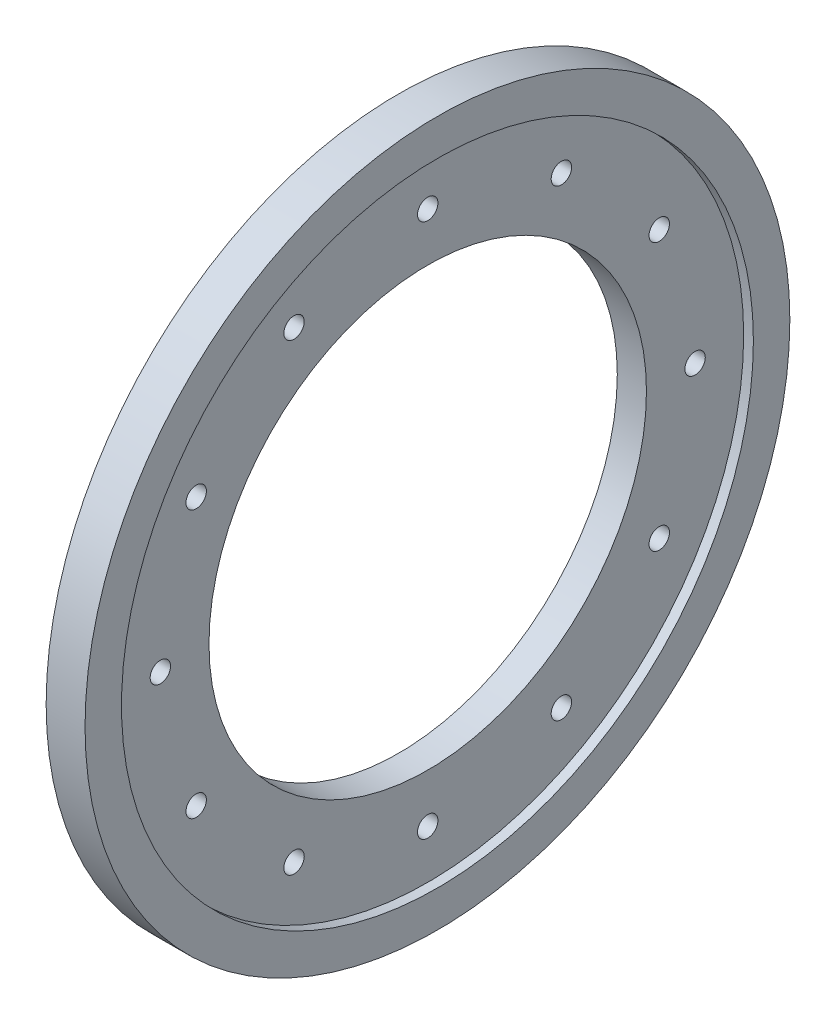
ISO-10303-21;
HEADER;
FILE_DESCRIPTION(('STEP AP214'),'2;1');
FILE_NAME('part.step','',(''),(''),'','','');
FILE_SCHEMA(('AUTOMOTIVE_DESIGN { 1 0 10303 214 1 1 1 1 }'));
ENDSEC;
DATA;
#1=APPLICATION_CONTEXT('core data for automotive mechanical design processes');
#2=APPLICATION_PROTOCOL_DEFINITION('international standard','automotive_design',2000,#1);
#3=PRODUCT_CONTEXT('',#1,'mechanical');
#4=PRODUCT('Part','Part','',(#3));
#5=PRODUCT_RELATED_PRODUCT_CATEGORY('part','',(#4));
#6=PRODUCT_DEFINITION_FORMATION('','',#4);
#7=PRODUCT_DEFINITION_CONTEXT('part definition',#1,'design');
#8=PRODUCT_DEFINITION('design','',#6,#7);
#9=PRODUCT_DEFINITION_SHAPE('','',#8);
#10=(LENGTH_UNIT() NAMED_UNIT(*) SI_UNIT(.MILLI.,.METRE.));
#11=(NAMED_UNIT(*) PLANE_ANGLE_UNIT() SI_UNIT($,.RADIAN.));
#12=(NAMED_UNIT(*) SI_UNIT($,.STERADIAN.) SOLID_ANGLE_UNIT());
#13=UNCERTAINTY_MEASURE_WITH_UNIT(LENGTH_MEASURE(1.E-05),#10,'distance_accuracy_value','');
#14=(GEOMETRIC_REPRESENTATION_CONTEXT(3) GLOBAL_UNCERTAINTY_ASSIGNED_CONTEXT((#13)) GLOBAL_UNIT_ASSIGNED_CONTEXT((#10,
#11,#12)) REPRESENTATION_CONTEXT('',''));
#15=CARTESIAN_POINT('',(0.,0.,0.));
#16=DIRECTION('',(0.,0.,1.));
#17=DIRECTION('',(1.,0.,0.));
#18=AXIS2_PLACEMENT_3D('',#15,#16,#17);
#19=CARTESIAN_POINT('',(4.,0.,0.));
#20=DIRECTION('',(-1.,0.,0.));
#21=DIRECTION('',(0.,0.,1.));
#22=AXIS2_PLACEMENT_3D('',#19,#20,#21);
#23=CYLINDRICAL_SURFACE('',#22,145.);
#24=CARTESIAN_POINT('',(4.,0.,0.));
#25=DIRECTION('',(-1.,0.,0.));
#26=DIRECTION('',(0.,0.,1.));
#27=AXIS2_PLACEMENT_3D('',#24,#25,#26);
#28=CIRCLE('',#27,145.);
#29=CARTESIAN_POINT('',(4.,0.,145.));
#30=VERTEX_POINT('',#29);
#31=EDGE_CURVE('E10',#30,#30,#28,.T.);
#32=ORIENTED_EDGE('',*,*,#31,.T.);
#33=EDGE_LOOP('',(#32));
#34=FACE_BOUND('',#33,.T.);
#35=CARTESIAN_POINT('',(-12.,0.,0.));
#36=DIRECTION('',(-1.,0.,0.));
#37=DIRECTION('',(0.,0.,1.));
#38=AXIS2_PLACEMENT_3D('',#35,#36,#37);
#39=CIRCLE('',#38,145.);
#40=CARTESIAN_POINT('',(-12.,0.,145.));
#41=VERTEX_POINT('',#40);
#42=EDGE_CURVE('E47',#41,#41,#39,.T.);
#43=ORIENTED_EDGE('',*,*,#42,.F.);
#44=EDGE_LOOP('',(#43));
#45=FACE_BOUND('',#44,.T.);
#46=ADVANCED_FACE('F41',(#34,#45),#23,.T.);
#47=CARTESIAN_POINT('',(4.,145.,0.));
#48=DIRECTION('',(1.,0.,0.));
#49=DIRECTION('',(0.,0.,-1.));
#50=AXIS2_PLACEMENT_3D('',#47,#48,#49);
#51=PLANE('',#50);
#52=CARTESIAN_POINT('',(3.99999999999999,0.,0.));
#53=DIRECTION('',(1.,0.,0.));
#54=DIRECTION('',(0.,0.,-1.));
#55=AXIS2_PLACEMENT_3D('',#52,#53,#54);
#56=CIRCLE('',#55,130.);
#57=CARTESIAN_POINT('',(3.99999999999999,0.,-130.));
#58=VERTEX_POINT('',#57);
#59=EDGE_CURVE('E63',#58,#58,#56,.T.);
#60=ORIENTED_EDGE('',*,*,#59,.F.);
#61=EDGE_LOOP('',(#60));
#62=FACE_BOUND('',#61,.T.);
#63=ORIENTED_EDGE('',*,*,#31,.F.);
#64=EDGE_LOOP('',(#63));
#65=FACE_BOUND('',#64,.T.);
#66=ADVANCED_FACE('F179',(#62,#65),#51,.T.);
#67=CARTESIAN_POINT('',(-12.,0.,0.));
#68=DIRECTION('',(-1.,0.,0.));
#69=DIRECTION('',(0.,0.,1.));
#70=AXIS2_PLACEMENT_3D('',#67,#68,#69);
#71=PLANE('',#70);
#72=CARTESIAN_POINT('',(-12.,0.,-110.));
#73=DIRECTION('',(1.,0.,0.));
#74=DIRECTION('',(0.,0.,-1.));
#75=AXIS2_PLACEMENT_3D('',#72,#73,#74);
#76=CIRCLE('',#75,4.19999999999998);
#77=CARTESIAN_POINT('',(-12.,0.,-114.2));
#78=VERTEX_POINT('',#77);
#79=EDGE_CURVE('E132',#78,#78,#76,.T.);
#80=ORIENTED_EDGE('',*,*,#79,.T.);
#81=EDGE_LOOP('',(#80));
#82=FACE_BOUND('',#81,.T.);
#83=CARTESIAN_POINT('',(-12.,55.,-95.2627944162883));
#84=DIRECTION('',(1.,0.,0.));
#85=DIRECTION('',(0.,0.,-1.));
#86=AXIS2_PLACEMENT_3D('',#83,#84,#85);
#87=CIRCLE('',#86,4.19999999999998);
#88=CARTESIAN_POINT('',(-12.,55.,-99.4627944162883));
#89=VERTEX_POINT('',#88);
#90=EDGE_CURVE('E126',#89,#89,#87,.T.);
#91=ORIENTED_EDGE('',*,*,#90,.T.);
#92=EDGE_LOOP('',(#91));
#93=FACE_BOUND('',#92,.T.);
#94=CARTESIAN_POINT('',(-12.,95.2627944162883,-55.));
#95=DIRECTION('',(1.,0.,0.));
#96=DIRECTION('',(0.,0.,-1.));
#97=AXIS2_PLACEMENT_3D('',#94,#95,#96);
#98=CIRCLE('',#97,4.19999999999998);
#99=CARTESIAN_POINT('',(-12.,95.2627944162883,-59.2));
#100=VERTEX_POINT('',#99);
#101=EDGE_CURVE('E120',#100,#100,#98,.T.);
#102=ORIENTED_EDGE('',*,*,#101,.T.);
#103=EDGE_LOOP('',(#102));
#104=FACE_BOUND('',#103,.T.);
#105=CARTESIAN_POINT('',(-12.,110.,0.));
#106=DIRECTION('',(1.,0.,0.));
#107=DIRECTION('',(0.,0.,-1.));
#108=AXIS2_PLACEMENT_3D('',#105,#106,#107);
#109=CIRCLE('',#108,4.19999999999998);
#110=CARTESIAN_POINT('',(-12.,110.,-4.19999999999996));
#111=VERTEX_POINT('',#110);
#112=EDGE_CURVE('E114',#111,#111,#109,.T.);
#113=ORIENTED_EDGE('',*,*,#112,.T.);
#114=EDGE_LOOP('',(#113));
#115=FACE_BOUND('',#114,.T.);
#116=CARTESIAN_POINT('',(-12.,95.2627944162883,55.));
#117=DIRECTION('',(1.,0.,0.));
#118=DIRECTION('',(0.,0.,-1.));
#119=AXIS2_PLACEMENT_3D('',#116,#117,#118);
#120=CIRCLE('',#119,4.19999999999998);
#121=CARTESIAN_POINT('',(-12.,95.2627944162883,50.8));
#122=VERTEX_POINT('',#121);
#123=EDGE_CURVE('E108',#122,#122,#120,.T.);
#124=ORIENTED_EDGE('',*,*,#123,.T.);
#125=EDGE_LOOP('',(#124));
#126=FACE_BOUND('',#125,.T.);
#127=CARTESIAN_POINT('',(-12.,55.,95.2627944162882));
#128=DIRECTION('',(1.,0.,0.));
#129=DIRECTION('',(0.,0.,-1.));
#130=AXIS2_PLACEMENT_3D('',#127,#128,#129);
#131=CIRCLE('',#130,4.19999999999998);
#132=CARTESIAN_POINT('',(-12.,55.,91.0627944162882));
#133=VERTEX_POINT('',#132);
#134=EDGE_CURVE('E102',#133,#133,#131,.T.);
#135=ORIENTED_EDGE('',*,*,#134,.T.);
#136=EDGE_LOOP('',(#135));
#137=FACE_BOUND('',#136,.T.);
#138=CARTESIAN_POINT('',(-12.,0.,110.));
#139=DIRECTION('',(1.,0.,0.));
#140=DIRECTION('',(0.,0.,-1.));
#141=AXIS2_PLACEMENT_3D('',#138,#139,#140);
#142=CIRCLE('',#141,4.19999999999998);
#143=CARTESIAN_POINT('',(-12.,0.,105.8));
#144=VERTEX_POINT('',#143);
#145=EDGE_CURVE('E96',#144,#144,#142,.T.);
#146=ORIENTED_EDGE('',*,*,#145,.T.);
#147=EDGE_LOOP('',(#146));
#148=FACE_BOUND('',#147,.T.);
#149=CARTESIAN_POINT('',(-12.,-55.,95.2627944162883));
#150=DIRECTION('',(1.,0.,0.));
#151=DIRECTION('',(0.,0.,-1.));
#152=AXIS2_PLACEMENT_3D('',#149,#150,#151);
#153=CIRCLE('',#152,4.19999999999998);
#154=CARTESIAN_POINT('',(-12.,-55.,91.0627944162883));
#155=VERTEX_POINT('',#154);
#156=EDGE_CURVE('E90',#155,#155,#153,.T.);
#157=ORIENTED_EDGE('',*,*,#156,.T.);
#158=EDGE_LOOP('',(#157));
#159=FACE_BOUND('',#158,.T.);
#160=CARTESIAN_POINT('',(-12.,-95.2627944162882,55.));
#161=DIRECTION('',(1.,0.,0.));
#162=DIRECTION('',(0.,0.,-1.));
#163=AXIS2_PLACEMENT_3D('',#160,#161,#162);
#164=CIRCLE('',#163,4.19999999999998);
#165=CARTESIAN_POINT('',(-12.,-95.2627944162882,50.8));
#166=VERTEX_POINT('',#165);
#167=EDGE_CURVE('E84',#166,#166,#164,.T.);
#168=ORIENTED_EDGE('',*,*,#167,.T.);
#169=EDGE_LOOP('',(#168));
#170=FACE_BOUND('',#169,.T.);
#171=CARTESIAN_POINT('',(-12.,-110.,1.15388975313457E-13));
#172=DIRECTION('',(1.,0.,0.));
#173=DIRECTION('',(0.,0.,-1.));
#174=AXIS2_PLACEMENT_3D('',#171,#172,#173);
#175=CIRCLE('',#174,4.19999999999998);
#176=CARTESIAN_POINT('',(-12.,-110.,-4.19999999999987));
#177=VERTEX_POINT('',#176);
#178=EDGE_CURVE('E78',#177,#177,#175,.T.);
#179=ORIENTED_EDGE('',*,*,#178,.T.);
#180=EDGE_LOOP('',(#179));
#181=FACE_BOUND('',#180,.T.);
#182=CARTESIAN_POINT('',(-12.,-95.2627944162883,-55.));
#183=DIRECTION('',(1.,0.,0.));
#184=DIRECTION('',(0.,0.,-1.));
#185=AXIS2_PLACEMENT_3D('',#182,#183,#184);
#186=CIRCLE('',#185,4.19999999999998);
#187=CARTESIAN_POINT('',(-12.,-95.2627944162883,-59.2));
#188=VERTEX_POINT('',#187);
#189=EDGE_CURVE('E72',#188,#188,#186,.T.);
#190=ORIENTED_EDGE('',*,*,#189,.T.);
#191=EDGE_LOOP('',(#190));
#192=FACE_BOUND('',#191,.T.);
#193=CARTESIAN_POINT('',(-12.,-55.,-95.2627944162882));
#194=DIRECTION('',(1.,0.,0.));
#195=DIRECTION('',(0.,0.,-1.));
#196=AXIS2_PLACEMENT_3D('',#193,#194,#195);
#197=CIRCLE('',#196,4.19999999999998);
#198=CARTESIAN_POINT('',(-12.,-55.,-99.4627944162882));
#199=VERTEX_POINT('',#198);
#200=EDGE_CURVE('E66',#199,#199,#197,.T.);
#201=ORIENTED_EDGE('',*,*,#200,.T.);
#202=EDGE_LOOP('',(#201));
#203=FACE_BOUND('',#202,.T.);
#204=CARTESIAN_POINT('',(-12.,0.,0.));
#205=DIRECTION('',(1.,0.,0.));
#206=DIRECTION('',(0.,0.,-1.));
#207=AXIS2_PLACEMENT_3D('',#204,#205,#206);
#208=CIRCLE('',#207,90.);
#209=CARTESIAN_POINT('',(-12.,0.,-90.));
#210=VERTEX_POINT('',#209);
#211=EDGE_CURVE('E51',#210,#210,#208,.T.);
#212=ORIENTED_EDGE('',*,*,#211,.T.);
#213=EDGE_LOOP('',(#212));
#214=FACE_BOUND('',#213,.T.);
#215=ORIENTED_EDGE('',*,*,#42,.T.);
#216=EDGE_LOOP('',(#215));
#217=FACE_BOUND('',#216,.T.);
#218=ADVANCED_FACE('F182',(#82,#93,#104,#115,#126,#137,#148,#159,#170,#181,#192,#203,#214,#217),
#71,.T.);
#219=CARTESIAN_POINT('',(4.,0.,0.));
#220=DIRECTION('',(1.,0.,0.));
#221=DIRECTION('',(0.,0.,-1.));
#222=AXIS2_PLACEMENT_3D('',#219,#220,#221);
#223=CYLINDRICAL_SURFACE('',#222,90.);
#224=ORIENTED_EDGE('',*,*,#211,.F.);
#225=EDGE_LOOP('',(#224));
#226=FACE_BOUND('',#225,.T.);
#227=CARTESIAN_POINT('',(0.,0.,0.));
#228=DIRECTION('',(1.,0.,0.));
#229=DIRECTION('',(0.,0.,-1.));
#230=AXIS2_PLACEMENT_3D('',#227,#228,#229);
#231=CIRCLE('',#230,90.);
#232=CARTESIAN_POINT('',(0.,0.,-90.));
#233=VERTEX_POINT('',#232);
#234=EDGE_CURVE('E55',#233,#233,#231,.T.);
#235=ORIENTED_EDGE('',*,*,#234,.T.);
#236=EDGE_LOOP('',(#235));
#237=FACE_BOUND('',#236,.T.);
#238=ADVANCED_FACE('F145',(#226,#237),#223,.F.);
#239=CARTESIAN_POINT('',(0.,90.,0.));
#240=DIRECTION('',(-1.,0.,0.));
#241=DIRECTION('',(0.,0.,1.));
#242=AXIS2_PLACEMENT_3D('',#239,#240,#241);
#243=PLANE('',#242);
#244=CARTESIAN_POINT('',(0.,0.,-110.));
#245=DIRECTION('',(1.,0.,0.));
#246=DIRECTION('',(0.,0.,-1.));
#247=AXIS2_PLACEMENT_3D('',#244,#245,#246);
#248=CIRCLE('',#247,4.19999999999998);
#249=CARTESIAN_POINT('',(0.,0.,-114.2));
#250=VERTEX_POINT('',#249);
#251=EDGE_CURVE('E135',#250,#250,#248,.T.);
#252=ORIENTED_EDGE('',*,*,#251,.F.);
#253=EDGE_LOOP('',(#252));
#254=FACE_BOUND('',#253,.T.);
#255=CARTESIAN_POINT('',(0.,55.,-95.2627944162883));
#256=DIRECTION('',(1.,0.,0.));
#257=DIRECTION('',(0.,0.,-1.));
#258=AXIS2_PLACEMENT_3D('',#255,#256,#257);
#259=CIRCLE('',#258,4.19999999999998);
#260=CARTESIAN_POINT('',(0.,55.,-99.4627944162883));
#261=VERTEX_POINT('',#260);
#262=EDGE_CURVE('E129',#261,#261,#259,.T.);
#263=ORIENTED_EDGE('',*,*,#262,.F.);
#264=EDGE_LOOP('',(#263));
#265=FACE_BOUND('',#264,.T.);
#266=CARTESIAN_POINT('',(0.,95.2627944162883,-55.));
#267=DIRECTION('',(1.,0.,0.));
#268=DIRECTION('',(0.,0.,-1.));
#269=AXIS2_PLACEMENT_3D('',#266,#267,#268);
#270=CIRCLE('',#269,4.19999999999998);
#271=CARTESIAN_POINT('',(0.,95.2627944162883,-59.2));
#272=VERTEX_POINT('',#271);
#273=EDGE_CURVE('E123',#272,#272,#270,.T.);
#274=ORIENTED_EDGE('',*,*,#273,.F.);
#275=EDGE_LOOP('',(#274));
#276=FACE_BOUND('',#275,.T.);
#277=CARTESIAN_POINT('',(0.,110.,0.));
#278=DIRECTION('',(1.,0.,0.));
#279=DIRECTION('',(0.,0.,-1.));
#280=AXIS2_PLACEMENT_3D('',#277,#278,#279);
#281=CIRCLE('',#280,4.19999999999998);
#282=CARTESIAN_POINT('',(0.,110.,-4.19999999999996));
#283=VERTEX_POINT('',#282);
#284=EDGE_CURVE('E117',#283,#283,#281,.T.);
#285=ORIENTED_EDGE('',*,*,#284,.F.);
#286=EDGE_LOOP('',(#285));
#287=FACE_BOUND('',#286,.T.);
#288=CARTESIAN_POINT('',(0.,95.2627944162883,55.));
#289=DIRECTION('',(1.,0.,0.));
#290=DIRECTION('',(0.,0.,-1.));
#291=AXIS2_PLACEMENT_3D('',#288,#289,#290);
#292=CIRCLE('',#291,4.19999999999998);
#293=CARTESIAN_POINT('',(0.,95.2627944162883,50.8));
#294=VERTEX_POINT('',#293);
#295=EDGE_CURVE('E111',#294,#294,#292,.T.);
#296=ORIENTED_EDGE('',*,*,#295,.F.);
#297=EDGE_LOOP('',(#296));
#298=FACE_BOUND('',#297,.T.);
#299=CARTESIAN_POINT('',(0.,55.,95.2627944162882));
#300=DIRECTION('',(1.,0.,0.));
#301=DIRECTION('',(0.,0.,-1.));
#302=AXIS2_PLACEMENT_3D('',#299,#300,#301);
#303=CIRCLE('',#302,4.19999999999998);
#304=CARTESIAN_POINT('',(0.,55.,91.0627944162882));
#305=VERTEX_POINT('',#304);
#306=EDGE_CURVE('E105',#305,#305,#303,.T.);
#307=ORIENTED_EDGE('',*,*,#306,.F.);
#308=EDGE_LOOP('',(#307));
#309=FACE_BOUND('',#308,.T.);
#310=CARTESIAN_POINT('',(0.,0.,110.));
#311=DIRECTION('',(1.,0.,0.));
#312=DIRECTION('',(0.,0.,-1.));
#313=AXIS2_PLACEMENT_3D('',#310,#311,#312);
#314=CIRCLE('',#313,4.19999999999998);
#315=CARTESIAN_POINT('',(0.,0.,105.8));
#316=VERTEX_POINT('',#315);
#317=EDGE_CURVE('E99',#316,#316,#314,.T.);
#318=ORIENTED_EDGE('',*,*,#317,.F.);
#319=EDGE_LOOP('',(#318));
#320=FACE_BOUND('',#319,.T.);
#321=CARTESIAN_POINT('',(0.,-55.,95.2627944162883));
#322=DIRECTION('',(1.,0.,0.));
#323=DIRECTION('',(0.,0.,-1.));
#324=AXIS2_PLACEMENT_3D('',#321,#322,#323);
#325=CIRCLE('',#324,4.19999999999998);
#326=CARTESIAN_POINT('',(0.,-55.,91.0627944162883));
#327=VERTEX_POINT('',#326);
#328=EDGE_CURVE('E93',#327,#327,#325,.T.);
#329=ORIENTED_EDGE('',*,*,#328,.F.);
#330=EDGE_LOOP('',(#329));
#331=FACE_BOUND('',#330,.T.);
#332=CARTESIAN_POINT('',(0.,-95.2627944162882,55.));
#333=DIRECTION('',(1.,0.,0.));
#334=DIRECTION('',(0.,0.,-1.));
#335=AXIS2_PLACEMENT_3D('',#332,#333,#334);
#336=CIRCLE('',#335,4.19999999999998);
#337=CARTESIAN_POINT('',(0.,-95.2627944162882,50.8));
#338=VERTEX_POINT('',#337);
#339=EDGE_CURVE('E87',#338,#338,#336,.T.);
#340=ORIENTED_EDGE('',*,*,#339,.F.);
#341=EDGE_LOOP('',(#340));
#342=FACE_BOUND('',#341,.T.);
#343=CARTESIAN_POINT('',(0.,-110.,1.15388975313457E-13));
#344=DIRECTION('',(1.,0.,0.));
#345=DIRECTION('',(0.,0.,-1.));
#346=AXIS2_PLACEMENT_3D('',#343,#344,#345);
#347=CIRCLE('',#346,4.19999999999998);
#348=CARTESIAN_POINT('',(0.,-110.,-4.19999999999987));
#349=VERTEX_POINT('',#348);
#350=EDGE_CURVE('E81',#349,#349,#347,.T.);
#351=ORIENTED_EDGE('',*,*,#350,.F.);
#352=EDGE_LOOP('',(#351));
#353=FACE_BOUND('',#352,.T.);
#354=CARTESIAN_POINT('',(0.,-95.2627944162883,-55.));
#355=DIRECTION('',(1.,0.,0.));
#356=DIRECTION('',(0.,0.,-1.));
#357=AXIS2_PLACEMENT_3D('',#354,#355,#356);
#358=CIRCLE('',#357,4.19999999999998);
#359=CARTESIAN_POINT('',(0.,-95.2627944162883,-59.2));
#360=VERTEX_POINT('',#359);
#361=EDGE_CURVE('E75',#360,#360,#358,.T.);
#362=ORIENTED_EDGE('',*,*,#361,.F.);
#363=EDGE_LOOP('',(#362));
#364=FACE_BOUND('',#363,.T.);
#365=CARTESIAN_POINT('',(0.,-55.,-95.2627944162882));
#366=DIRECTION('',(1.,0.,0.));
#367=DIRECTION('',(0.,0.,-1.));
#368=AXIS2_PLACEMENT_3D('',#365,#366,#367);
#369=CIRCLE('',#368,4.19999999999998);
#370=CARTESIAN_POINT('',(0.,-55.,-99.4627944162882));
#371=VERTEX_POINT('',#370);
#372=EDGE_CURVE('E69',#371,#371,#369,.T.);
#373=ORIENTED_EDGE('',*,*,#372,.F.);
#374=EDGE_LOOP('',(#373));
#375=FACE_BOUND('',#374,.T.);
#376=ORIENTED_EDGE('',*,*,#234,.F.);
#377=EDGE_LOOP('',(#376));
#378=FACE_BOUND('',#377,.T.);
#379=CARTESIAN_POINT('',(0.,0.,0.));
#380=DIRECTION('',(1.,0.,0.));
#381=DIRECTION('',(0.,0.,-1.));
#382=AXIS2_PLACEMENT_3D('',#379,#380,#381);
#383=CIRCLE('',#382,130.);
#384=CARTESIAN_POINT('',(0.,0.,-130.));
#385=VERTEX_POINT('',#384);
#386=EDGE_CURVE('E60',#385,#385,#383,.T.);
#387=ORIENTED_EDGE('',*,*,#386,.T.);
#388=EDGE_LOOP('',(#387));
#389=FACE_BOUND('',#388,.T.);
#390=ADVANCED_FACE('F141',(#254,#265,#276,#287,#298,#309,#320,#331,#342,#353,#364,#375,#378,
#389),#243,.F.);
#391=CARTESIAN_POINT('',(4.,0.,0.));
#392=DIRECTION('',(1.,0.,0.));
#393=DIRECTION('',(0.,0.,-1.));
#394=AXIS2_PLACEMENT_3D('',#391,#392,#393);
#395=CYLINDRICAL_SURFACE('',#394,130.);
#396=ORIENTED_EDGE('',*,*,#386,.F.);
#397=EDGE_LOOP('',(#396));
#398=FACE_BOUND('',#397,.T.);
#399=ORIENTED_EDGE('',*,*,#59,.T.);
#400=EDGE_LOOP('',(#399));
#401=FACE_BOUND('',#400,.T.);
#402=ADVANCED_FACE('F144',(#398,#401),#395,.F.);
#403=CARTESIAN_POINT('',(0.,-55.,-95.2627944162882));
#404=DIRECTION('',(1.,0.,0.));
#405=DIRECTION('',(0.,0.,-1.));
#406=AXIS2_PLACEMENT_3D('',#403,#404,#405);
#407=CYLINDRICAL_SURFACE('',#406,4.19999999999998);
#408=ORIENTED_EDGE('',*,*,#200,.F.);
#409=EDGE_LOOP('',(#408));
#410=FACE_BOUND('',#409,.T.);
#411=ORIENTED_EDGE('',*,*,#372,.T.);
#412=EDGE_LOOP('',(#411));
#413=FACE_BOUND('',#412,.T.);
#414=ADVANCED_FACE('F175',(#410,#413),#407,.F.);
#415=CARTESIAN_POINT('',(0.,-95.2627944162883,-55.));
#416=DIRECTION('',(1.,0.,0.));
#417=DIRECTION('',(0.,0.,-1.));
#418=AXIS2_PLACEMENT_3D('',#415,#416,#417);
#419=CYLINDRICAL_SURFACE('',#418,4.19999999999998);
#420=ORIENTED_EDGE('',*,*,#189,.F.);
#421=EDGE_LOOP('',(#420));
#422=FACE_BOUND('',#421,.T.);
#423=ORIENTED_EDGE('',*,*,#361,.T.);
#424=EDGE_LOOP('',(#423));
#425=FACE_BOUND('',#424,.T.);
#426=ADVANCED_FACE('F195',(#422,#425),#419,.F.);
#427=CARTESIAN_POINT('',(0.,-110.,1.15388975313457E-13));
#428=DIRECTION('',(1.,0.,0.));
#429=DIRECTION('',(0.,0.,-1.));
#430=AXIS2_PLACEMENT_3D('',#427,#428,#429);
#431=CYLINDRICAL_SURFACE('',#430,4.19999999999998);
#432=ORIENTED_EDGE('',*,*,#178,.F.);
#433=EDGE_LOOP('',(#432));
#434=FACE_BOUND('',#433,.T.);
#435=ORIENTED_EDGE('',*,*,#350,.T.);
#436=EDGE_LOOP('',(#435));
#437=FACE_BOUND('',#436,.T.);
#438=ADVANCED_FACE('F199',(#434,#437),#431,.F.);
#439=CARTESIAN_POINT('',(0.,-95.2627944162882,55.));
#440=DIRECTION('',(1.,0.,0.));
#441=DIRECTION('',(0.,0.,-1.));
#442=AXIS2_PLACEMENT_3D('',#439,#440,#441);
#443=CYLINDRICAL_SURFACE('',#442,4.19999999999998);
#444=ORIENTED_EDGE('',*,*,#167,.F.);
#445=EDGE_LOOP('',(#444));
#446=FACE_BOUND('',#445,.T.);
#447=ORIENTED_EDGE('',*,*,#339,.T.);
#448=EDGE_LOOP('',(#447));
#449=FACE_BOUND('',#448,.T.);
#450=ADVANCED_FACE('F203',(#446,#449),#443,.F.);
#451=CARTESIAN_POINT('',(0.,-55.,95.2627944162883));
#452=DIRECTION('',(1.,0.,0.));
#453=DIRECTION('',(0.,0.,-1.));
#454=AXIS2_PLACEMENT_3D('',#451,#452,#453);
#455=CYLINDRICAL_SURFACE('',#454,4.19999999999998);
#456=ORIENTED_EDGE('',*,*,#156,.F.);
#457=EDGE_LOOP('',(#456));
#458=FACE_BOUND('',#457,.T.);
#459=ORIENTED_EDGE('',*,*,#328,.T.);
#460=EDGE_LOOP('',(#459));
#461=FACE_BOUND('',#460,.T.);
#462=ADVANCED_FACE('F207',(#458,#461),#455,.F.);
#463=CARTESIAN_POINT('',(0.,0.,110.));
#464=DIRECTION('',(1.,0.,0.));
#465=DIRECTION('',(0.,0.,-1.));
#466=AXIS2_PLACEMENT_3D('',#463,#464,#465);
#467=CYLINDRICAL_SURFACE('',#466,4.19999999999998);
#468=ORIENTED_EDGE('',*,*,#145,.F.);
#469=EDGE_LOOP('',(#468));
#470=FACE_BOUND('',#469,.T.);
#471=ORIENTED_EDGE('',*,*,#317,.T.);
#472=EDGE_LOOP('',(#471));
#473=FACE_BOUND('',#472,.T.);
#474=ADVANCED_FACE('F211',(#470,#473),#467,.F.);
#475=CARTESIAN_POINT('',(0.,55.,95.2627944162882));
#476=DIRECTION('',(1.,0.,0.));
#477=DIRECTION('',(0.,0.,-1.));
#478=AXIS2_PLACEMENT_3D('',#475,#476,#477);
#479=CYLINDRICAL_SURFACE('',#478,4.19999999999998);
#480=ORIENTED_EDGE('',*,*,#134,.F.);
#481=EDGE_LOOP('',(#480));
#482=FACE_BOUND('',#481,.T.);
#483=ORIENTED_EDGE('',*,*,#306,.T.);
#484=EDGE_LOOP('',(#483));
#485=FACE_BOUND('',#484,.T.);
#486=ADVANCED_FACE('F215',(#482,#485),#479,.F.);
#487=CARTESIAN_POINT('',(0.,95.2627944162883,55.));
#488=DIRECTION('',(1.,0.,0.));
#489=DIRECTION('',(0.,0.,-1.));
#490=AXIS2_PLACEMENT_3D('',#487,#488,#489);
#491=CYLINDRICAL_SURFACE('',#490,4.19999999999998);
#492=ORIENTED_EDGE('',*,*,#123,.F.);
#493=EDGE_LOOP('',(#492));
#494=FACE_BOUND('',#493,.T.);
#495=ORIENTED_EDGE('',*,*,#295,.T.);
#496=EDGE_LOOP('',(#495));
#497=FACE_BOUND('',#496,.T.);
#498=ADVANCED_FACE('F219',(#494,#497),#491,.F.);
#499=CARTESIAN_POINT('',(0.,110.,0.));
#500=DIRECTION('',(1.,0.,0.));
#501=DIRECTION('',(0.,0.,-1.));
#502=AXIS2_PLACEMENT_3D('',#499,#500,#501);
#503=CYLINDRICAL_SURFACE('',#502,4.19999999999998);
#504=ORIENTED_EDGE('',*,*,#112,.F.);
#505=EDGE_LOOP('',(#504));
#506=FACE_BOUND('',#505,.T.);
#507=ORIENTED_EDGE('',*,*,#284,.T.);
#508=EDGE_LOOP('',(#507));
#509=FACE_BOUND('',#508,.T.);
#510=ADVANCED_FACE('F223',(#506,#509),#503,.F.);
#511=CARTESIAN_POINT('',(0.,95.2627944162883,-55.));
#512=DIRECTION('',(1.,0.,0.));
#513=DIRECTION('',(0.,0.,-1.));
#514=AXIS2_PLACEMENT_3D('',#511,#512,#513);
#515=CYLINDRICAL_SURFACE('',#514,4.19999999999998);
#516=ORIENTED_EDGE('',*,*,#101,.F.);
#517=EDGE_LOOP('',(#516));
#518=FACE_BOUND('',#517,.T.);
#519=ORIENTED_EDGE('',*,*,#273,.T.);
#520=EDGE_LOOP('',(#519));
#521=FACE_BOUND('',#520,.T.);
#522=ADVANCED_FACE('F227',(#518,#521),#515,.F.);
#523=CARTESIAN_POINT('',(0.,55.,-95.2627944162883));
#524=DIRECTION('',(1.,0.,0.));
#525=DIRECTION('',(0.,0.,-1.));
#526=AXIS2_PLACEMENT_3D('',#523,#524,#525);
#527=CYLINDRICAL_SURFACE('',#526,4.19999999999998);
#528=ORIENTED_EDGE('',*,*,#90,.F.);
#529=EDGE_LOOP('',(#528));
#530=FACE_BOUND('',#529,.T.);
#531=ORIENTED_EDGE('',*,*,#262,.T.);
#532=EDGE_LOOP('',(#531));
#533=FACE_BOUND('',#532,.T.);
#534=ADVANCED_FACE('F231',(#530,#533),#527,.F.);
#535=CARTESIAN_POINT('',(0.,0.,-110.));
#536=DIRECTION('',(1.,0.,0.));
#537=DIRECTION('',(0.,0.,-1.));
#538=AXIS2_PLACEMENT_3D('',#535,#536,#537);
#539=CYLINDRICAL_SURFACE('',#538,4.19999999999998);
#540=ORIENTED_EDGE('',*,*,#79,.F.);
#541=EDGE_LOOP('',(#540));
#542=FACE_BOUND('',#541,.T.);
#543=ORIENTED_EDGE('',*,*,#251,.T.);
#544=EDGE_LOOP('',(#543));
#545=FACE_BOUND('',#544,.T.);
#546=ADVANCED_FACE('F139',(#542,#545),#539,.F.);
#547=CLOSED_SHELL('',(#46,#66,#218,#238,#390,#402,#414,#426,#438,#450,#462,#474,#486,#498,#510,
#522,#534,#546));
#548=MANIFOLD_SOLID_BREP('B2',#547);
#549=ADVANCED_BREP_SHAPE_REPRESENTATION('',(#18,#548),#14);
#550=SHAPE_DEFINITION_REPRESENTATION(#9,#549);
ENDSEC;
END-ISO-10303-21;
